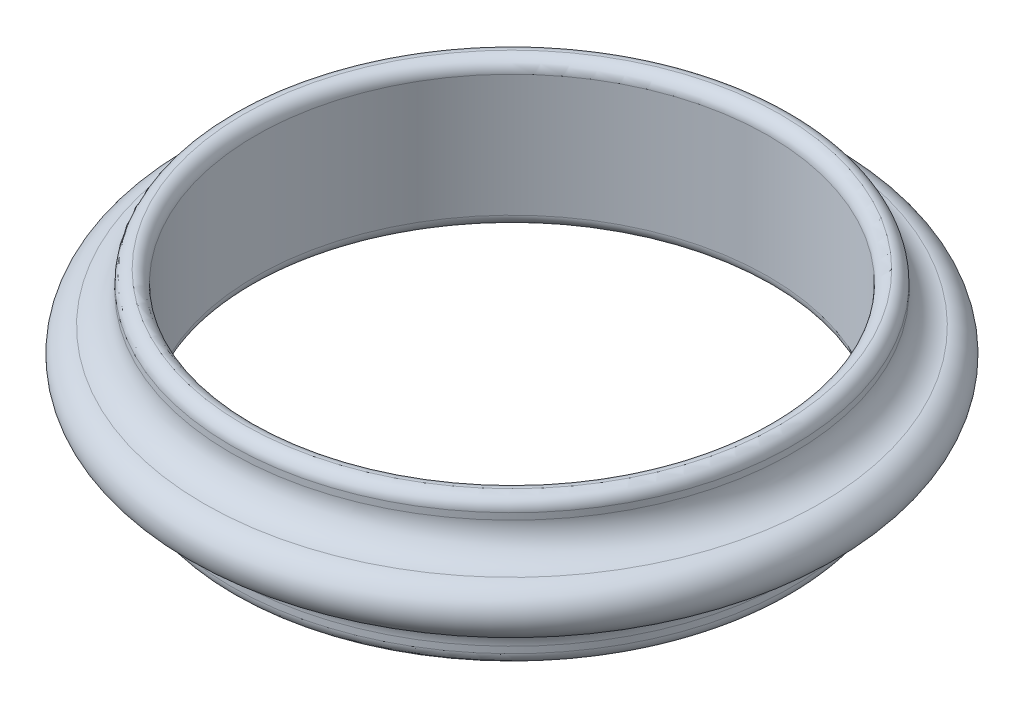
ISO-10303-21;
HEADER;
FILE_DESCRIPTION(('STEP AP214'),'2;1');
FILE_NAME('part.step','',(''),(''),'','','');
FILE_SCHEMA(('AUTOMOTIVE_DESIGN { 1 0 10303 214 1 1 1 1 }'));
ENDSEC;
DATA;
#1=APPLICATION_CONTEXT('core data for automotive mechanical design processes');
#2=APPLICATION_PROTOCOL_DEFINITION('international standard','automotive_design',2000,#1);
#3=PRODUCT_CONTEXT('',#1,'mechanical');
#4=PRODUCT('Part','Part','',(#3));
#5=PRODUCT_RELATED_PRODUCT_CATEGORY('part','',(#4));
#6=PRODUCT_DEFINITION_FORMATION('','',#4);
#7=PRODUCT_DEFINITION_CONTEXT('part definition',#1,'design');
#8=PRODUCT_DEFINITION('design','',#6,#7);
#9=PRODUCT_DEFINITION_SHAPE('','',#8);
#10=(LENGTH_UNIT() NAMED_UNIT(*) SI_UNIT(.MILLI.,.METRE.));
#11=(NAMED_UNIT(*) PLANE_ANGLE_UNIT() SI_UNIT($,.RADIAN.));
#12=(NAMED_UNIT(*) SI_UNIT($,.STERADIAN.) SOLID_ANGLE_UNIT());
#13=UNCERTAINTY_MEASURE_WITH_UNIT(LENGTH_MEASURE(1.E-05),#10,'distance_accuracy_value','');
#14=(GEOMETRIC_REPRESENTATION_CONTEXT(3) GLOBAL_UNCERTAINTY_ASSIGNED_CONTEXT((#13)) GLOBAL_UNIT_ASSIGNED_CONTEXT((#10,
#11,#12)) REPRESENTATION_CONTEXT('',''));
#15=CARTESIAN_POINT('',(0.,0.,0.));
#16=DIRECTION('',(0.,0.,1.));
#17=DIRECTION('',(1.,0.,0.));
#18=AXIS2_PLACEMENT_3D('',#15,#16,#17);
#19=CARTESIAN_POINT('',(0.,-4.47213595499958,0.));
#20=DIRECTION('',(0.,1.,0.));
#21=DIRECTION('',(0.,0.,1.));
#22=AXIS2_PLACEMENT_3D('',#19,#20,#21);
#23=TOROIDAL_SURFACE('',#22,25.5,2.5);
#24=CARTESIAN_POINT('',(0.,-4.47213595499958,0.));
#25=DIRECTION('',(0.,1.,0.));
#26=DIRECTION('',(0.,0.,1.));
#27=AXIS2_PLACEMENT_3D('',#24,#25,#26);
#28=CIRCLE('',#27,23.);
#29=CARTESIAN_POINT('',(0.,-4.47213595499958,23.));
#30=VERTEX_POINT('',#29);
#31=EDGE_CURVE('E62',#30,#30,#28,.T.);
#32=ORIENTED_EDGE('',*,*,#31,.T.);
#33=EDGE_LOOP('',(#32));
#34=FACE_BOUND('',#33,.T.);
#35=CARTESIAN_POINT('',(0.,-1.98761597999981,0.));
#36=DIRECTION('',(0.,1.,0.));
#37=DIRECTION('',(0.,0.,1.));
#38=AXIS2_PLACEMENT_3D('',#35,#36,#37);
#39=CIRCLE('',#38,25.2222222222222);
#40=CARTESIAN_POINT('',(0.,-1.98761597999981,25.2222222222222));
#41=VERTEX_POINT('',#40);
#42=EDGE_CURVE('E135',#41,#41,#39,.T.);
#43=ORIENTED_EDGE('',*,*,#42,.F.);
#44=EDGE_LOOP('',(#43));
#45=FACE_BOUND('',#44,.T.);
#46=ADVANCED_FACE('F41',(#34,#45),#23,.F.);
#47=CARTESIAN_POINT('',(0.,0.,0.));
#48=DIRECTION('',(0.,1.,0.));
#49=DIRECTION('',(0.,0.,1.));
#50=AXIS2_PLACEMENT_3D('',#47,#48,#49);
#51=TOROIDAL_SURFACE('',#50,25.,2.);
#52=ORIENTED_EDGE('',*,*,#42,.T.);
#53=EDGE_LOOP('',(#52));
#54=FACE_BOUND('',#53,.T.);
#55=CARTESIAN_POINT('',(0.,1.98761597999981,0.));
#56=DIRECTION('',(0.,1.,0.));
#57=DIRECTION('',(0.,0.,1.));
#58=AXIS2_PLACEMENT_3D('',#55,#56,#57);
#59=CIRCLE('',#58,25.2222222222222);
#60=CARTESIAN_POINT('',(0.,1.98761597999981,25.2222222222222));
#61=VERTEX_POINT('',#60);
#62=EDGE_CURVE('E128',#61,#61,#59,.T.);
#63=ORIENTED_EDGE('',*,*,#62,.F.);
#64=EDGE_LOOP('',(#63));
#65=FACE_BOUND('',#64,.T.);
#66=ADVANCED_FACE('F88',(#54,#65),#51,.T.);
#67=CARTESIAN_POINT('',(0.,4.47213595499958,0.));
#68=DIRECTION('',(0.,1.,0.));
#69=DIRECTION('',(0.,0.,1.));
#70=AXIS2_PLACEMENT_3D('',#67,#68,#69);
#71=TOROIDAL_SURFACE('',#70,25.5,2.5);
#72=ORIENTED_EDGE('',*,*,#62,.T.);
#73=EDGE_LOOP('',(#72));
#74=FACE_BOUND('',#73,.T.);
#75=CARTESIAN_POINT('',(0.,4.47213595499958,0.));
#76=DIRECTION('',(0.,1.,0.));
#77=DIRECTION('',(0.,0.,1.));
#78=AXIS2_PLACEMENT_3D('',#75,#76,#77);
#79=CIRCLE('',#78,23.);
#80=CARTESIAN_POINT('',(0.,4.47213595499958,23.));
#81=VERTEX_POINT('',#80);
#82=EDGE_CURVE('E68',#81,#81,#79,.T.);
#83=ORIENTED_EDGE('',*,*,#82,.F.);
#84=EDGE_LOOP('',(#83));
#85=FACE_BOUND('',#84,.T.);
#86=ADVANCED_FACE('F94',(#74,#85),#71,.F.);
#87=CARTESIAN_POINT('',(0.,18.7253936901861,0.));
#88=DIRECTION('',(0.,1.,0.));
#89=DIRECTION('',(0.,0.,1.));
#90=AXIS2_PLACEMENT_3D('',#87,#88,#89);
#91=CYLINDRICAL_SURFACE('',#90,23.);
#92=CARTESIAN_POINT('',(0.,5.,0.));
#93=DIRECTION('',(0.,1.,0.));
#94=DIRECTION('',(0.,0.,1.));
#95=AXIS2_PLACEMENT_3D('',#92,#93,#94);
#96=CIRCLE('',#95,23.);
#97=CARTESIAN_POINT('',(0.,5.,23.));
#98=VERTEX_POINT('',#97);
#99=EDGE_CURVE('E10',#98,#98,#96,.F.);
#100=ORIENTED_EDGE('',*,*,#99,.T.);
#101=EDGE_LOOP('',(#100));
#102=FACE_BOUND('',#101,.T.);
#103=ORIENTED_EDGE('',*,*,#82,.T.);
#104=EDGE_LOOP('',(#103));
#105=FACE_BOUND('',#104,.T.);
#106=ADVANCED_FACE('F116',(#102,#105),#91,.T.);
#107=CARTESIAN_POINT('',(0.,18.7253936901861,0.));
#108=DIRECTION('',(0.,1.,0.));
#109=DIRECTION('',(0.,0.,1.));
#110=AXIS2_PLACEMENT_3D('',#107,#108,#109);
#111=CYLINDRICAL_SURFACE('',#110,21.);
#112=CARTESIAN_POINT('',(0.,-5.,0.));
#113=DIRECTION('',(0.,-1.,0.));
#114=DIRECTION('',(0.,0.,-1.));
#115=AXIS2_PLACEMENT_3D('',#112,#113,#114);
#116=CIRCLE('',#115,21.);
#117=CARTESIAN_POINT('',(0.,-5.,-21.));
#118=VERTEX_POINT('',#117);
#119=EDGE_CURVE('E56',#118,#118,#116,.T.);
#120=ORIENTED_EDGE('',*,*,#119,.T.);
#121=EDGE_LOOP('',(#120));
#122=FACE_BOUND('',#121,.T.);
#123=CARTESIAN_POINT('',(0.,5.,0.));
#124=DIRECTION('',(0.,1.,0.));
#125=DIRECTION('',(0.,0.,1.));
#126=AXIS2_PLACEMENT_3D('',#123,#124,#125);
#127=CIRCLE('',#126,21.);
#128=CARTESIAN_POINT('',(0.,5.,21.));
#129=VERTEX_POINT('',#128);
#130=EDGE_CURVE('E141',#129,#129,#127,.T.);
#131=ORIENTED_EDGE('',*,*,#130,.T.);
#132=EDGE_LOOP('',(#131));
#133=FACE_BOUND('',#132,.T.);
#134=ADVANCED_FACE('F106',(#122,#133),#111,.F.);
#135=CARTESIAN_POINT('',(0.,18.7253936901861,0.));
#136=DIRECTION('',(0.,1.,0.));
#137=DIRECTION('',(0.,0.,1.));
#138=AXIS2_PLACEMENT_3D('',#135,#136,#137);
#139=CYLINDRICAL_SURFACE('',#138,23.);
#140=CARTESIAN_POINT('',(0.,-5.,0.));
#141=DIRECTION('',(0.,-1.,0.));
#142=DIRECTION('',(0.,0.,-1.));
#143=AXIS2_PLACEMENT_3D('',#140,#141,#142);
#144=CIRCLE('',#143,23.);
#145=CARTESIAN_POINT('',(0.,-5.,-23.));
#146=VERTEX_POINT('',#145);
#147=EDGE_CURVE('E50',#146,#146,#144,.F.);
#148=ORIENTED_EDGE('',*,*,#147,.T.);
#149=EDGE_LOOP('',(#148));
#150=FACE_BOUND('',#149,.T.);
#151=ORIENTED_EDGE('',*,*,#31,.F.);
#152=EDGE_LOOP('',(#151));
#153=FACE_BOUND('',#152,.T.);
#154=ADVANCED_FACE('F101',(#150,#153),#139,.T.);
#155=CARTESIAN_POINT('',(0.,-5.,0.));
#156=DIRECTION('',(0.,-1.,0.));
#157=DIRECTION('',(0.,0.,-1.));
#158=AXIS2_PLACEMENT_3D('',#155,#156,#157);
#159=TOROIDAL_SURFACE('',#158,22.,1.);
#160=ORIENTED_EDGE('',*,*,#147,.F.);
#161=EDGE_LOOP('',(#160));
#162=FACE_BOUND('',#161,.T.);
#163=CARTESIAN_POINT('',(0.,-6.,0.));
#164=DIRECTION('',(0.,-1.,0.));
#165=DIRECTION('',(0.,0.,-1.));
#166=AXIS2_PLACEMENT_3D('',#163,#164,#165);
#167=CIRCLE('',#166,22.);
#168=CARTESIAN_POINT('',(0.,-6.,-22.));
#169=VERTEX_POINT('',#168);
#170=EDGE_CURVE('E59',#169,#169,#167,.T.);
#171=ORIENTED_EDGE('',*,*,#170,.F.);
#172=EDGE_LOOP('',(#171));
#173=FACE_BOUND('',#172,.T.);
#174=ADVANCED_FACE('F83',(#162,#173),#159,.T.);
#175=CARTESIAN_POINT('',(0.,-5.,0.));
#176=DIRECTION('',(0.,-1.,0.));
#177=DIRECTION('',(0.,0.,-1.));
#178=AXIS2_PLACEMENT_3D('',#175,#176,#177);
#179=TOROIDAL_SURFACE('',#178,22.,1.);
#180=ORIENTED_EDGE('',*,*,#119,.F.);
#181=EDGE_LOOP('',(#180));
#182=FACE_BOUND('',#181,.T.);
#183=ORIENTED_EDGE('',*,*,#170,.T.);
#184=EDGE_LOOP('',(#183));
#185=FACE_BOUND('',#184,.T.);
#186=ADVANCED_FACE('F76',(#182,#185),#179,.T.);
#187=CARTESIAN_POINT('',(0.,5.,0.));
#188=DIRECTION('',(0.,1.,0.));
#189=DIRECTION('',(0.,0.,1.));
#190=AXIS2_PLACEMENT_3D('',#187,#188,#189);
#191=TOROIDAL_SURFACE('',#190,22.,1.);
#192=ORIENTED_EDGE('',*,*,#130,.F.);
#193=EDGE_LOOP('',(#192));
#194=FACE_BOUND('',#193,.T.);
#195=CARTESIAN_POINT('',(0.,6.,0.));
#196=DIRECTION('',(0.,1.,0.));
#197=DIRECTION('',(0.,0.,1.));
#198=AXIS2_PLACEMENT_3D('',#195,#196,#197);
#199=CIRCLE('',#198,22.);
#200=CARTESIAN_POINT('',(0.,6.,22.));
#201=VERTEX_POINT('',#200);
#202=EDGE_CURVE('E45',#201,#201,#199,.F.);
#203=ORIENTED_EDGE('',*,*,#202,.F.);
#204=EDGE_LOOP('',(#203));
#205=FACE_BOUND('',#204,.T.);
#206=ADVANCED_FACE('F43',(#194,#205),#191,.T.);
#207=CARTESIAN_POINT('',(0.,5.,0.));
#208=DIRECTION('',(0.,1.,0.));
#209=DIRECTION('',(0.,0.,1.));
#210=AXIS2_PLACEMENT_3D('',#207,#208,#209);
#211=TOROIDAL_SURFACE('',#210,22.,1.);
#212=ORIENTED_EDGE('',*,*,#99,.F.);
#213=EDGE_LOOP('',(#212));
#214=FACE_BOUND('',#213,.T.);
#215=ORIENTED_EDGE('',*,*,#202,.T.);
#216=EDGE_LOOP('',(#215));
#217=FACE_BOUND('',#216,.T.);
#218=ADVANCED_FACE('F73',(#214,#217),#211,.T.);
#219=CLOSED_SHELL('',(#46,#66,#86,#106,#134,#154,#174,#186,#206,#218));
#220=MANIFOLD_SOLID_BREP('B2',#219);
#221=ADVANCED_BREP_SHAPE_REPRESENTATION('',(#18,#220),#14);
#222=SHAPE_DEFINITION_REPRESENTATION(#9,#221);
ENDSEC;
END-ISO-10303-21;
